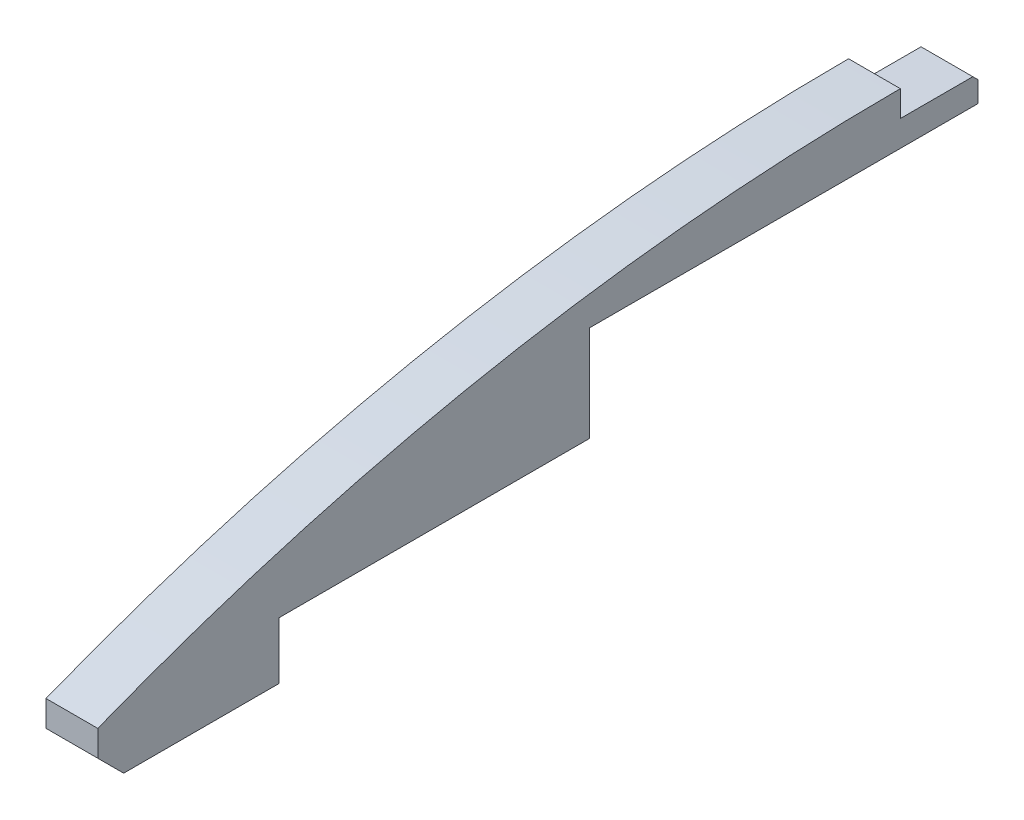
ISO-10303-21;
HEADER;
FILE_DESCRIPTION(('STEP AP214'),'2;1');
FILE_NAME('part.step','',(''),(''),'','','');
FILE_SCHEMA(('AUTOMOTIVE_DESIGN { 1 0 10303 214 1 1 1 1 }'));
ENDSEC;
DATA;
#1=APPLICATION_CONTEXT('core data for automotive mechanical design processes');
#2=APPLICATION_PROTOCOL_DEFINITION('international standard','automotive_design',2000,#1);
#3=PRODUCT_CONTEXT('',#1,'mechanical');
#4=PRODUCT('Part','Part','',(#3));
#5=PRODUCT_RELATED_PRODUCT_CATEGORY('part','',(#4));
#6=PRODUCT_DEFINITION_FORMATION('','',#4);
#7=PRODUCT_DEFINITION_CONTEXT('part definition',#1,'design');
#8=PRODUCT_DEFINITION('design','',#6,#7);
#9=PRODUCT_DEFINITION_SHAPE('','',#8);
#10=(LENGTH_UNIT() NAMED_UNIT(*) SI_UNIT(.MILLI.,.METRE.));
#11=(NAMED_UNIT(*) PLANE_ANGLE_UNIT() SI_UNIT($,.RADIAN.));
#12=(NAMED_UNIT(*) SI_UNIT($,.STERADIAN.) SOLID_ANGLE_UNIT());
#13=UNCERTAINTY_MEASURE_WITH_UNIT(LENGTH_MEASURE(1.E-05),#10,'distance_accuracy_value','');
#14=(GEOMETRIC_REPRESENTATION_CONTEXT(3) GLOBAL_UNCERTAINTY_ASSIGNED_CONTEXT((#13)) GLOBAL_UNIT_ASSIGNED_CONTEXT((#10,
#11,#12)) REPRESENTATION_CONTEXT('',''));
#15=CARTESIAN_POINT('',(0.,0.,0.));
#16=DIRECTION('',(0.,0.,1.));
#17=DIRECTION('',(1.,0.,0.));
#18=AXIS2_PLACEMENT_3D('',#15,#16,#17);
#19=CARTESIAN_POINT('',(10.,-378.453389830508,0.));
#20=DIRECTION('',(-1.,0.,0.));
#21=DIRECTION('',(0.,0.,1.));
#22=AXIS2_PLACEMENT_3D('',#19,#20,#21);
#23=CYLINDRICAL_SURFACE('',#22,421.953389830508);
#24=CARTESIAN_POINT('',(0.,-378.453389830508,0.));
#25=DIRECTION('',(1.,0.,0.));
#26=DIRECTION('',(0.,0.,-1.));
#27=AXIS2_PLACEMENT_3D('',#24,#25,#26);
#28=CIRCLE('',#27,421.953389830508);
#29=CARTESIAN_POINT('',(0.,43.5,0.));
#30=VERTEX_POINT('',#29);
#31=CARTESIAN_POINT('',(0.,14.,155.));
#32=VERTEX_POINT('',#31);
#33=EDGE_CURVE('E150',#30,#32,#28,.T.);
#34=ORIENTED_EDGE('',*,*,#33,.T.);
#35=DIRECTION('',(-1.,0.,0.));
#36=VECTOR('',#35,1.);
#37=CARTESIAN_POINT('',(10.,14.,155.));
#38=LINE('',#37,#36);
#39=CARTESIAN_POINT('',(10.,14.,155.));
#40=VERTEX_POINT('',#39);
#41=EDGE_CURVE('E11',#40,#32,#38,.T.);
#42=ORIENTED_EDGE('',*,*,#41,.F.);
#43=CARTESIAN_POINT('',(10.,-378.453389830508,0.));
#44=DIRECTION('',(1.,0.,0.));
#45=DIRECTION('',(0.,0.,-1.));
#46=AXIS2_PLACEMENT_3D('',#43,#44,#45);
#47=CIRCLE('',#46,421.953389830508);
#48=CARTESIAN_POINT('',(10.,43.5,0.));
#49=VERTEX_POINT('',#48);
#50=EDGE_CURVE('E172',#49,#40,#47,.T.);
#51=ORIENTED_EDGE('',*,*,#50,.F.);
#52=DIRECTION('',(-1.,0.,0.));
#53=VECTOR('',#52,1.);
#54=CARTESIAN_POINT('',(10.,43.5,0.));
#55=LINE('',#54,#53);
#56=EDGE_CURVE('E146',#49,#30,#55,.T.);
#57=ORIENTED_EDGE('',*,*,#56,.T.);
#58=EDGE_LOOP('',(#34,#42,#51,#57));
#59=FACE_BOUND('',#58,.T.);
#60=ADVANCED_FACE('F30',(#59),#23,.T.);
#61=CARTESIAN_POINT('',(10.,14.,155.));
#62=DIRECTION('',(0.,0.,-1.));
#63=DIRECTION('',(-1.,0.,0.));
#64=AXIS2_PLACEMENT_3D('',#61,#62,#63);
#65=PLANE('',#64);
#66=DIRECTION('',(0.,-1.,0.));
#67=VECTOR('',#66,1.);
#68=CARTESIAN_POINT('',(0.,14.,155.));
#69=LINE('',#68,#67);
#70=CARTESIAN_POINT('',(0.,8.99999999999998,155.));
#71=VERTEX_POINT('',#70);
#72=EDGE_CURVE('E153',#32,#71,#69,.T.);
#73=ORIENTED_EDGE('',*,*,#72,.T.);
#74=DIRECTION('',(-1.,0.,0.));
#75=VECTOR('',#74,1.);
#76=CARTESIAN_POINT('',(10.,8.99999999999998,155.));
#77=LINE('',#76,#75);
#78=CARTESIAN_POINT('',(10.,8.99999999999998,155.));
#79=VERTEX_POINT('',#78);
#80=EDGE_CURVE('E38',#79,#71,#77,.T.);
#81=ORIENTED_EDGE('',*,*,#80,.F.);
#82=DIRECTION('',(0.,-1.,0.));
#83=VECTOR('',#82,1.);
#84=CARTESIAN_POINT('',(10.,14.,155.));
#85=LINE('',#84,#83);
#86=EDGE_CURVE('E101',#40,#79,#85,.T.);
#87=ORIENTED_EDGE('',*,*,#86,.F.);
#88=ORIENTED_EDGE('',*,*,#41,.T.);
#89=EDGE_LOOP('',(#73,#81,#87,#88));
#90=FACE_BOUND('',#89,.T.);
#91=ADVANCED_FACE('F250',(#90),#65,.F.);
#92=CARTESIAN_POINT('',(10.,8.99999999999998,155.));
#93=DIRECTION('',(0.,0.70710678118655,-0.707106781186545));
#94=DIRECTION('',(0.,0.707106781186545,0.70710678118655));
#95=AXIS2_PLACEMENT_3D('',#92,#93,#94);
#96=PLANE('',#95);
#97=DIRECTION('',(0.,-0.707106781186545,-0.70710678118655));
#98=VECTOR('',#97,1.);
#99=CARTESIAN_POINT('',(0.,8.99999999999998,155.));
#100=LINE('',#99,#98);
#101=CARTESIAN_POINT('',(0.,3.99999999999998,150.));
#102=VERTEX_POINT('',#101);
#103=EDGE_CURVE('E155',#71,#102,#100,.T.);
#104=ORIENTED_EDGE('',*,*,#103,.T.);
#105=DIRECTION('',(-1.,0.,0.));
#106=VECTOR('',#105,1.);
#107=CARTESIAN_POINT('',(10.,3.99999999999998,150.));
#108=LINE('',#107,#106);
#109=CARTESIAN_POINT('',(10.,3.99999999999998,150.));
#110=VERTEX_POINT('',#109);
#111=EDGE_CURVE('E191',#110,#102,#108,.T.);
#112=ORIENTED_EDGE('',*,*,#111,.F.);
#113=DIRECTION('',(0.,-0.707106781186545,-0.70710678118655));
#114=VECTOR('',#113,1.);
#115=CARTESIAN_POINT('',(10.,8.99999999999998,155.));
#116=LINE('',#115,#114);
#117=EDGE_CURVE('E199',#79,#110,#116,.T.);
#118=ORIENTED_EDGE('',*,*,#117,.F.);
#119=ORIENTED_EDGE('',*,*,#80,.T.);
#120=EDGE_LOOP('',(#104,#112,#118,#119));
#121=FACE_BOUND('',#120,.T.);
#122=ADVANCED_FACE('F197',(#121),#96,.F.);
#123=CARTESIAN_POINT('',(10.,3.99999999999998,150.));
#124=DIRECTION('',(0.,1.,0.));
#125=DIRECTION('',(0.,0.,1.));
#126=AXIS2_PLACEMENT_3D('',#123,#124,#125);
#127=PLANE('',#126);
#128=DIRECTION('',(0.,0.,-1.));
#129=VECTOR('',#128,1.);
#130=CARTESIAN_POINT('',(0.,3.99999999999998,150.));
#131=LINE('',#130,#129);
#132=CARTESIAN_POINT('',(0.,3.99999999999998,120.));
#133=VERTEX_POINT('',#132);
#134=EDGE_CURVE('E157',#102,#133,#131,.T.);
#135=ORIENTED_EDGE('',*,*,#134,.T.);
#136=DIRECTION('',(-1.,0.,0.));
#137=VECTOR('',#136,1.);
#138=CARTESIAN_POINT('',(10.,3.99999999999998,120.));
#139=LINE('',#138,#137);
#140=CARTESIAN_POINT('',(10.,3.99999999999998,120.));
#141=VERTEX_POINT('',#140);
#142=EDGE_CURVE('E188',#141,#133,#139,.T.);
#143=ORIENTED_EDGE('',*,*,#142,.F.);
#144=DIRECTION('',(0.,0.,-1.));
#145=VECTOR('',#144,1.);
#146=CARTESIAN_POINT('',(10.,3.99999999999998,150.));
#147=LINE('',#146,#145);
#148=EDGE_CURVE('E217',#110,#141,#147,.T.);
#149=ORIENTED_EDGE('',*,*,#148,.F.);
#150=ORIENTED_EDGE('',*,*,#111,.T.);
#151=EDGE_LOOP('',(#135,#143,#149,#150));
#152=FACE_BOUND('',#151,.T.);
#153=ADVANCED_FACE('F208',(#152),#127,.F.);
#154=CARTESIAN_POINT('',(10.,3.99999999999998,120.));
#155=DIRECTION('',(0.,0.,1.));
#156=DIRECTION('',(1.,0.,0.));
#157=AXIS2_PLACEMENT_3D('',#154,#155,#156);
#158=PLANE('',#157);
#159=DIRECTION('',(0.,1.,0.));
#160=VECTOR('',#159,1.);
#161=CARTESIAN_POINT('',(0.,3.99999999999998,120.));
#162=LINE('',#161,#160);
#163=CARTESIAN_POINT('',(0.,15.,120.));
#164=VERTEX_POINT('',#163);
#165=EDGE_CURVE('E159',#133,#164,#162,.T.);
#166=ORIENTED_EDGE('',*,*,#165,.T.);
#167=DIRECTION('',(-1.,0.,0.));
#168=VECTOR('',#167,1.);
#169=CARTESIAN_POINT('',(10.,15.,120.));
#170=LINE('',#169,#168);
#171=CARTESIAN_POINT('',(10.,15.,120.));
#172=VERTEX_POINT('',#171);
#173=EDGE_CURVE('E185',#172,#164,#170,.T.);
#174=ORIENTED_EDGE('',*,*,#173,.F.);
#175=DIRECTION('',(0.,1.,0.));
#176=VECTOR('',#175,1.);
#177=CARTESIAN_POINT('',(10.,3.99999999999998,120.));
#178=LINE('',#177,#176);
#179=EDGE_CURVE('E214',#141,#172,#178,.T.);
#180=ORIENTED_EDGE('',*,*,#179,.F.);
#181=ORIENTED_EDGE('',*,*,#142,.T.);
#182=EDGE_LOOP('',(#166,#174,#180,#181));
#183=FACE_BOUND('',#182,.T.);
#184=ADVANCED_FACE('F212',(#183),#158,.F.);
#185=CARTESIAN_POINT('',(10.,15.,120.));
#186=DIRECTION('',(0.,1.,0.));
#187=DIRECTION('',(0.,0.,1.));
#188=AXIS2_PLACEMENT_3D('',#185,#186,#187);
#189=PLANE('',#188);
#190=DIRECTION('',(0.,0.,-1.));
#191=VECTOR('',#190,1.);
#192=CARTESIAN_POINT('',(0.,15.,120.));
#193=LINE('',#192,#191);
#194=CARTESIAN_POINT('',(0.,15.,60.));
#195=VERTEX_POINT('',#194);
#196=EDGE_CURVE('E161',#164,#195,#193,.T.);
#197=ORIENTED_EDGE('',*,*,#196,.T.);
#198=DIRECTION('',(-1.,0.,0.));
#199=VECTOR('',#198,1.);
#200=CARTESIAN_POINT('',(10.,15.,60.));
#201=LINE('',#200,#199);
#202=CARTESIAN_POINT('',(10.,15.,60.));
#203=VERTEX_POINT('',#202);
#204=EDGE_CURVE('E182',#203,#195,#201,.T.);
#205=ORIENTED_EDGE('',*,*,#204,.F.);
#206=DIRECTION('',(0.,0.,-1.));
#207=VECTOR('',#206,1.);
#208=CARTESIAN_POINT('',(10.,15.,120.));
#209=LINE('',#208,#207);
#210=EDGE_CURVE('E216',#172,#203,#209,.T.);
#211=ORIENTED_EDGE('',*,*,#210,.F.);
#212=ORIENTED_EDGE('',*,*,#173,.T.);
#213=EDGE_LOOP('',(#197,#205,#211,#212));
#214=FACE_BOUND('',#213,.T.);
#215=ADVANCED_FACE('F263',(#214),#189,.F.);
#216=CARTESIAN_POINT('',(10.,15.,60.));
#217=DIRECTION('',(0.,0.,1.));
#218=DIRECTION('',(1.,0.,0.));
#219=AXIS2_PLACEMENT_3D('',#216,#217,#218);
#220=PLANE('',#219);
#221=DIRECTION('',(0.,1.,0.));
#222=VECTOR('',#221,1.);
#223=CARTESIAN_POINT('',(0.,15.,60.));
#224=LINE('',#223,#222);
#225=CARTESIAN_POINT('',(0.,33.5,60.));
#226=VERTEX_POINT('',#225);
#227=EDGE_CURVE('E163',#195,#226,#224,.T.);
#228=ORIENTED_EDGE('',*,*,#227,.T.);
#229=DIRECTION('',(-1.,0.,0.));
#230=VECTOR('',#229,1.);
#231=CARTESIAN_POINT('',(10.,33.5,60.));
#232=LINE('',#231,#230);
#233=CARTESIAN_POINT('',(10.,33.5,60.));
#234=VERTEX_POINT('',#233);
#235=EDGE_CURVE('E179',#234,#226,#232,.T.);
#236=ORIENTED_EDGE('',*,*,#235,.F.);
#237=DIRECTION('',(0.,1.,0.));
#238=VECTOR('',#237,1.);
#239=CARTESIAN_POINT('',(10.,15.,60.));
#240=LINE('',#239,#238);
#241=EDGE_CURVE('E219',#203,#234,#240,.T.);
#242=ORIENTED_EDGE('',*,*,#241,.F.);
#243=ORIENTED_EDGE('',*,*,#204,.T.);
#244=EDGE_LOOP('',(#228,#236,#242,#243));
#245=FACE_BOUND('',#244,.T.);
#246=ADVANCED_FACE('F266',(#245),#220,.F.);
#247=CARTESIAN_POINT('',(10.,33.5,-15.));
#248=DIRECTION('',(0.,1.,0.));
#249=DIRECTION('',(0.,0.,1.));
#250=AXIS2_PLACEMENT_3D('',#247,#248,#249);
#251=PLANE('',#250);
#252=DIRECTION('',(0.,0.,-1.));
#253=VECTOR('',#252,1.);
#254=CARTESIAN_POINT('',(0.,33.5,-15.));
#255=LINE('',#254,#253);
#256=CARTESIAN_POINT('',(0.,33.5,-15.));
#257=VERTEX_POINT('',#256);
#258=EDGE_CURVE('E165',#226,#257,#255,.T.);
#259=ORIENTED_EDGE('',*,*,#258,.T.);
#260=DIRECTION('',(-1.,0.,0.));
#261=VECTOR('',#260,1.);
#262=CARTESIAN_POINT('',(10.,33.5,-15.));
#263=LINE('',#262,#261);
#264=CARTESIAN_POINT('',(10.,33.5,-15.));
#265=VERTEX_POINT('',#264);
#266=EDGE_CURVE('E176',#265,#257,#263,.T.);
#267=ORIENTED_EDGE('',*,*,#266,.F.);
#268=DIRECTION('',(0.,0.,-1.));
#269=VECTOR('',#268,1.);
#270=CARTESIAN_POINT('',(10.,33.5,-15.));
#271=LINE('',#270,#269);
#272=EDGE_CURVE('E225',#234,#265,#271,.T.);
#273=ORIENTED_EDGE('',*,*,#272,.F.);
#274=ORIENTED_EDGE('',*,*,#235,.T.);
#275=EDGE_LOOP('',(#259,#267,#273,#274));
#276=FACE_BOUND('',#275,.T.);
#277=ADVANCED_FACE('F231',(#276),#251,.F.);
#278=CARTESIAN_POINT('',(10.,37.5,-15.));
#279=DIRECTION('',(0.,0.,1.));
#280=DIRECTION('',(1.,0.,0.));
#281=AXIS2_PLACEMENT_3D('',#278,#279,#280);
#282=PLANE('',#281);
#283=DIRECTION('',(0.,1.,0.));
#284=VECTOR('',#283,1.);
#285=CARTESIAN_POINT('',(0.,37.5,-15.));
#286=LINE('',#285,#284);
#287=CARTESIAN_POINT('',(0.,37.5,-15.));
#288=VERTEX_POINT('',#287);
#289=EDGE_CURVE('E167',#257,#288,#286,.T.);
#290=ORIENTED_EDGE('',*,*,#289,.T.);
#291=DIRECTION('',(-1.,0.,0.));
#292=VECTOR('',#291,1.);
#293=CARTESIAN_POINT('',(10.,37.5,-15.));
#294=LINE('',#293,#292);
#295=CARTESIAN_POINT('',(10.,37.5,-15.));
#296=VERTEX_POINT('',#295);
#297=EDGE_CURVE('E141',#296,#288,#294,.T.);
#298=ORIENTED_EDGE('',*,*,#297,.F.);
#299=DIRECTION('',(0.,1.,0.));
#300=VECTOR('',#299,1.);
#301=CARTESIAN_POINT('',(10.,37.5,-15.));
#302=LINE('',#301,#300);
#303=EDGE_CURVE('E132',#265,#296,#302,.T.);
#304=ORIENTED_EDGE('',*,*,#303,.F.);
#305=ORIENTED_EDGE('',*,*,#266,.T.);
#306=EDGE_LOOP('',(#290,#298,#304,#305));
#307=FACE_BOUND('',#306,.T.);
#308=ADVANCED_FACE('F235',(#307),#282,.F.);
#309=CARTESIAN_POINT('',(10.,38.5,-14.));
#310=DIRECTION('',(0.,-0.707106781186548,0.707106781186548));
#311=DIRECTION('',(0.,-0.707106781186548,-0.707106781186548));
#312=AXIS2_PLACEMENT_3D('',#309,#310,#311);
#313=PLANE('',#312);
#314=DIRECTION('',(0.,0.707106781186547,0.707106781186547));
#315=VECTOR('',#314,1.);
#316=CARTESIAN_POINT('',(0.,38.5,-14.));
#317=LINE('',#316,#315);
#318=CARTESIAN_POINT('',(0.,38.5,-14.));
#319=VERTEX_POINT('',#318);
#320=EDGE_CURVE('E140',#288,#319,#317,.T.);
#321=ORIENTED_EDGE('',*,*,#320,.T.);
#322=DIRECTION('',(-1.,0.,0.));
#323=VECTOR('',#322,1.);
#324=CARTESIAN_POINT('',(10.,38.5,-14.));
#325=LINE('',#324,#323);
#326=CARTESIAN_POINT('',(10.,38.5,-14.));
#327=VERTEX_POINT('',#326);
#328=EDGE_CURVE('E137',#327,#319,#325,.T.);
#329=ORIENTED_EDGE('',*,*,#328,.F.);
#330=DIRECTION('',(0.,0.707106781186547,0.707106781186547));
#331=VECTOR('',#330,1.);
#332=CARTESIAN_POINT('',(10.,38.5,-14.));
#333=LINE('',#332,#331);
#334=EDGE_CURVE('E126',#296,#327,#333,.T.);
#335=ORIENTED_EDGE('',*,*,#334,.F.);
#336=ORIENTED_EDGE('',*,*,#297,.T.);
#337=EDGE_LOOP('',(#321,#329,#335,#336));
#338=FACE_BOUND('',#337,.T.);
#339=ADVANCED_FACE('F138',(#338),#313,.F.);
#340=CARTESIAN_POINT('',(10.,38.5,0.));
#341=DIRECTION('',(0.,-1.,0.));
#342=DIRECTION('',(0.,0.,-1.));
#343=AXIS2_PLACEMENT_3D('',#340,#341,#342);
#344=PLANE('',#343);
#345=DIRECTION('',(0.,0.,1.));
#346=VECTOR('',#345,1.);
#347=CARTESIAN_POINT('',(0.,38.5,0.));
#348=LINE('',#347,#346);
#349=CARTESIAN_POINT('',(0.,38.5,0.));
#350=VERTEX_POINT('',#349);
#351=EDGE_CURVE('E87',#319,#350,#348,.T.);
#352=ORIENTED_EDGE('',*,*,#351,.T.);
#353=DIRECTION('',(-1.,0.,0.));
#354=VECTOR('',#353,1.);
#355=CARTESIAN_POINT('',(10.,38.5,0.));
#356=LINE('',#355,#354);
#357=CARTESIAN_POINT('',(10.,38.5,0.));
#358=VERTEX_POINT('',#357);
#359=EDGE_CURVE('E142',#358,#350,#356,.T.);
#360=ORIENTED_EDGE('',*,*,#359,.F.);
#361=DIRECTION('',(0.,0.,1.));
#362=VECTOR('',#361,1.);
#363=CARTESIAN_POINT('',(10.,38.5,0.));
#364=LINE('',#363,#362);
#365=EDGE_CURVE('E130',#327,#358,#364,.T.);
#366=ORIENTED_EDGE('',*,*,#365,.F.);
#367=ORIENTED_EDGE('',*,*,#328,.T.);
#368=EDGE_LOOP('',(#352,#360,#366,#367));
#369=FACE_BOUND('',#368,.T.);
#370=ADVANCED_FACE('F144',(#369),#344,.F.);
#371=CARTESIAN_POINT('',(10.,43.5,0.));
#372=DIRECTION('',(0.,0.,1.));
#373=DIRECTION('',(0.,-1.,0.));
#374=AXIS2_PLACEMENT_3D('',#371,#372,#373);
#375=PLANE('',#374);
#376=DIRECTION('',(0.,1.,0.));
#377=VECTOR('',#376,1.);
#378=CARTESIAN_POINT('',(0.,43.5,0.));
#379=LINE('',#378,#377);
#380=EDGE_CURVE('E93',#350,#30,#379,.T.);
#381=ORIENTED_EDGE('',*,*,#380,.T.);
#382=ORIENTED_EDGE('',*,*,#56,.F.);
#383=DIRECTION('',(0.,1.,0.));
#384=VECTOR('',#383,1.);
#385=CARTESIAN_POINT('',(10.,43.5,0.));
#386=LINE('',#385,#384);
#387=EDGE_CURVE('E46',#358,#49,#386,.T.);
#388=ORIENTED_EDGE('',*,*,#387,.F.);
#389=ORIENTED_EDGE('',*,*,#359,.T.);
#390=EDGE_LOOP('',(#381,#382,#388,#389));
#391=FACE_BOUND('',#390,.T.);
#392=ADVANCED_FACE('F239',(#391),#375,.F.);
#393=CARTESIAN_POINT('',(10.,-378.453389830508,0.));
#394=DIRECTION('',(1.,0.,0.));
#395=DIRECTION('',(0.,0.,-1.));
#396=AXIS2_PLACEMENT_3D('',#393,#394,#395);
#397=PLANE('',#396);
#398=ORIENTED_EDGE('',*,*,#50,.T.);
#399=ORIENTED_EDGE('',*,*,#86,.T.);
#400=ORIENTED_EDGE('',*,*,#117,.T.);
#401=ORIENTED_EDGE('',*,*,#148,.T.);
#402=ORIENTED_EDGE('',*,*,#179,.T.);
#403=ORIENTED_EDGE('',*,*,#210,.T.);
#404=ORIENTED_EDGE('',*,*,#241,.T.);
#405=ORIENTED_EDGE('',*,*,#272,.T.);
#406=ORIENTED_EDGE('',*,*,#303,.T.);
#407=ORIENTED_EDGE('',*,*,#334,.T.);
#408=ORIENTED_EDGE('',*,*,#365,.T.);
#409=ORIENTED_EDGE('',*,*,#387,.T.);
#410=EDGE_LOOP('',(#398,#399,#400,#401,#402,#403,#404,#405,#406,#407,#408,#409));
#411=FACE_BOUND('',#410,.T.);
#412=ADVANCED_FACE('F128',(#411),#397,.T.);
#413=CARTESIAN_POINT('',(0.,-378.453389830508,0.));
#414=DIRECTION('',(1.,0.,0.));
#415=DIRECTION('',(0.,0.,-1.));
#416=AXIS2_PLACEMENT_3D('',#413,#414,#415);
#417=PLANE('',#416);
#418=ORIENTED_EDGE('',*,*,#33,.F.);
#419=ORIENTED_EDGE('',*,*,#380,.F.);
#420=ORIENTED_EDGE('',*,*,#351,.F.);
#421=ORIENTED_EDGE('',*,*,#320,.F.);
#422=ORIENTED_EDGE('',*,*,#289,.F.);
#423=ORIENTED_EDGE('',*,*,#258,.F.);
#424=ORIENTED_EDGE('',*,*,#227,.F.);
#425=ORIENTED_EDGE('',*,*,#196,.F.);
#426=ORIENTED_EDGE('',*,*,#165,.F.);
#427=ORIENTED_EDGE('',*,*,#134,.F.);
#428=ORIENTED_EDGE('',*,*,#103,.F.);
#429=ORIENTED_EDGE('',*,*,#72,.F.);
#430=EDGE_LOOP('',(#418,#419,#420,#421,#422,#423,#424,#425,#426,#427,#428,#429));
#431=FACE_BOUND('',#430,.T.);
#432=ADVANCED_FACE('F203',(#431),#417,.F.);
#433=CLOSED_SHELL('',(#60,#91,#122,#153,#184,#215,#246,#277,#308,#339,#370,#392,#412,#432));
#434=MANIFOLD_SOLID_BREP('B2',#433);
#435=ADVANCED_BREP_SHAPE_REPRESENTATION('',(#18,#434),#14);
#436=SHAPE_DEFINITION_REPRESENTATION(#9,#435);
ENDSEC;
END-ISO-10303-21;
